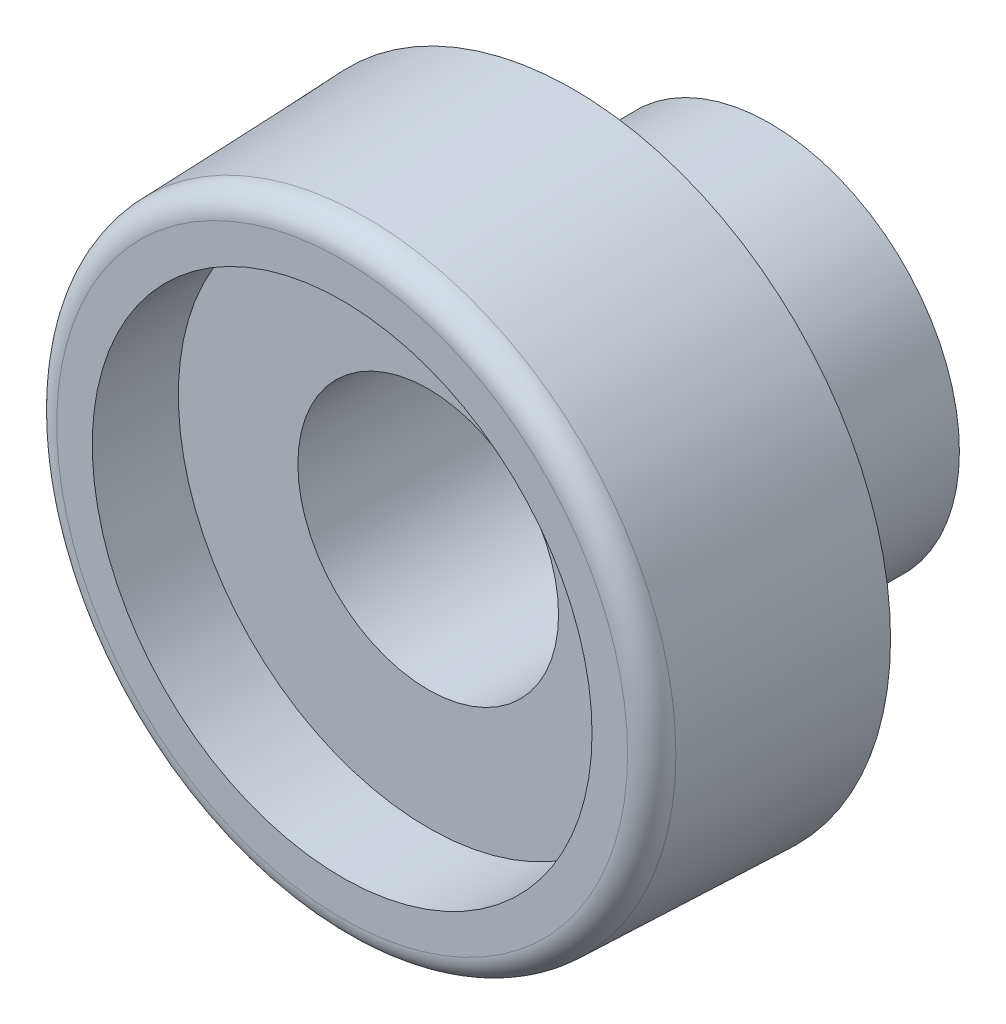
ISO-10303-21;
HEADER;
FILE_DESCRIPTION(('STEP AP214'),'2;1');
FILE_NAME('part.step','',(''),(''),'','','');
FILE_SCHEMA(('AUTOMOTIVE_DESIGN { 1 0 10303 214 1 1 1 1 }'));
ENDSEC;
DATA;
#1=APPLICATION_CONTEXT('core data for automotive mechanical design processes');
#2=APPLICATION_PROTOCOL_DEFINITION('international standard','automotive_design',2000,#1);
#3=PRODUCT_CONTEXT('',#1,'mechanical');
#4=PRODUCT('Part','Part','',(#3));
#5=PRODUCT_RELATED_PRODUCT_CATEGORY('part','',(#4));
#6=PRODUCT_DEFINITION_FORMATION('','',#4);
#7=PRODUCT_DEFINITION_CONTEXT('part definition',#1,'design');
#8=PRODUCT_DEFINITION('design','',#6,#7);
#9=PRODUCT_DEFINITION_SHAPE('','',#8);
#10=(LENGTH_UNIT() NAMED_UNIT(*) SI_UNIT(.MILLI.,.METRE.));
#11=(NAMED_UNIT(*) PLANE_ANGLE_UNIT() SI_UNIT($,.RADIAN.));
#12=(NAMED_UNIT(*) SI_UNIT($,.STERADIAN.) SOLID_ANGLE_UNIT());
#13=UNCERTAINTY_MEASURE_WITH_UNIT(LENGTH_MEASURE(1.E-05),#10,'distance_accuracy_value','');
#14=(GEOMETRIC_REPRESENTATION_CONTEXT(3) GLOBAL_UNCERTAINTY_ASSIGNED_CONTEXT((#13)) GLOBAL_UNIT_ASSIGNED_CONTEXT((#10,
#11,#12)) REPRESENTATION_CONTEXT('',''));
#15=CARTESIAN_POINT('',(0.,0.,0.));
#16=DIRECTION('',(0.,0.,1.));
#17=DIRECTION('',(1.,0.,0.));
#18=AXIS2_PLACEMENT_3D('',#15,#16,#17);
#19=CARTESIAN_POINT('',(0.,0.,0.));
#20=DIRECTION('',(0.,0.,1.));
#21=DIRECTION('',(1.,0.,0.));
#22=AXIS2_PLACEMENT_3D('',#19,#20,#21);
#23=CYLINDRICAL_SURFACE('',#22,2.65);
#24=CARTESIAN_POINT('',(0.,0.,2.95));
#25=DIRECTION('',(0.,0.,1.));
#26=DIRECTION('',(1.,0.,0.));
#27=AXIS2_PLACEMENT_3D('',#24,#25,#26);
#28=CIRCLE('',#27,2.65);
#29=CARTESIAN_POINT('',(2.65,0.,2.95));
#30=VERTEX_POINT('',#29);
#31=EDGE_CURVE('E52',#30,#30,#28,.F.);
#32=ORIENTED_EDGE('',*,*,#31,.F.);
#33=EDGE_LOOP('',(#32));
#34=FACE_BOUND('',#33,.T.);
#35=CARTESIAN_POINT('',(0.,0.,-4.));
#36=DIRECTION('',(0.,0.,-1.));
#37=DIRECTION('',(-1.,0.,0.));
#38=AXIS2_PLACEMENT_3D('',#35,#36,#37);
#39=CIRCLE('',#38,2.65);
#40=CARTESIAN_POINT('',(-2.65,0.,-4.));
#41=VERTEX_POINT('',#40);
#42=EDGE_CURVE('E69',#41,#41,#39,.F.);
#43=ORIENTED_EDGE('',*,*,#42,.F.);
#44=EDGE_LOOP('',(#43));
#45=FACE_BOUND('',#44,.T.);
#46=ADVANCED_FACE('F33',(#34,#45),#23,.F.);
#47=CARTESIAN_POINT('',(0.,0.,4.7));
#48=DIRECTION('',(0.,0.,1.));
#49=DIRECTION('',(1.,0.,0.));
#50=AXIS2_PLACEMENT_3D('',#47,#48,#49);
#51=PLANE('',#50);
#52=CARTESIAN_POINT('',(0.,0.,4.7));
#53=DIRECTION('',(0.,0.,1.));
#54=DIRECTION('',(1.,0.,0.));
#55=AXIS2_PLACEMENT_3D('',#52,#53,#54);
#56=CIRCLE('',#55,5.08074525599957);
#57=CARTESIAN_POINT('',(5.08074525599957,0.,4.7));
#58=VERTEX_POINT('',#57);
#59=EDGE_CURVE('E59',#58,#58,#56,.T.);
#60=ORIENTED_EDGE('',*,*,#59,.F.);
#61=EDGE_LOOP('',(#60));
#62=FACE_BOUND('',#61,.T.);
#63=CARTESIAN_POINT('',(0.,0.,4.7));
#64=DIRECTION('',(0.,0.,1.));
#65=DIRECTION('',(1.,0.,0.));
#66=AXIS2_PLACEMENT_3D('',#63,#64,#65);
#67=CIRCLE('',#66,5.80302799598525);
#68=CARTESIAN_POINT('',(5.80302799598525,0.,4.7));
#69=VERTEX_POINT('',#68);
#70=EDGE_CURVE('E44',#69,#69,#67,.T.);
#71=ORIENTED_EDGE('',*,*,#70,.T.);
#72=EDGE_LOOP('',(#71));
#73=FACE_BOUND('',#72,.T.);
#74=ADVANCED_FACE('F77',(#62,#73),#51,.T.);
#75=CARTESIAN_POINT('',(0.,0.,0.));
#76=DIRECTION('',(0.,0.,1.));
#77=DIRECTION('',(1.,0.,0.));
#78=AXIS2_PLACEMENT_3D('',#75,#76,#77);
#79=PLANE('',#78);
#80=CARTESIAN_POINT('',(0.,0.,0.));
#81=DIRECTION('',(0.,0.,1.));
#82=DIRECTION('',(1.,0.,0.));
#83=AXIS2_PLACEMENT_3D('',#80,#81,#82);
#84=CIRCLE('',#83,3.85);
#85=CARTESIAN_POINT('',(3.85,0.,0.));
#86=VERTEX_POINT('',#85);
#87=EDGE_CURVE('E10',#86,#86,#84,.F.);
#88=ORIENTED_EDGE('',*,*,#87,.F.);
#89=EDGE_LOOP('',(#88));
#90=FACE_BOUND('',#89,.T.);
#91=CARTESIAN_POINT('',(0.,0.,0.));
#92=DIRECTION('',(0.,0.,1.));
#93=DIRECTION('',(1.,0.,0.));
#94=AXIS2_PLACEMENT_3D('',#91,#92,#93);
#95=CIRCLE('',#94,6.45);
#96=CARTESIAN_POINT('',(6.45,0.,0.));
#97=VERTEX_POINT('',#96);
#98=EDGE_CURVE('E49',#97,#97,#95,.T.);
#99=ORIENTED_EDGE('',*,*,#98,.F.);
#100=EDGE_LOOP('',(#99));
#101=FACE_BOUND('',#100,.T.);
#102=ADVANCED_FACE('F83',(#90,#101),#79,.F.);
#103=CARTESIAN_POINT('',(0.,0.,0.));
#104=DIRECTION('',(0.,0.,-1.));
#105=DIRECTION('',(1.,0.,0.));
#106=AXIS2_PLACEMENT_3D('',#103,#104,#105);
#107=CONICAL_SURFACE('',#106,6.45,0.0349065850398866);
#108=CARTESIAN_POINT('',(0.,0.,4.21744974835125));
#109=DIRECTION('',(0.,0.,-1.));
#110=DIRECTION('',(-1.,0.,0.));
#111=AXIS2_PLACEMENT_3D('',#108,#109,#110);
#112=CIRCLE('',#111,6.3027234094948);
#113=CARTESIAN_POINT('',(-6.3027234094948,0.,4.21744974835125));
#114=VERTEX_POINT('',#113);
#115=EDGE_CURVE('E40',#114,#114,#112,.T.);
#116=ORIENTED_EDGE('',*,*,#115,.T.);
#117=EDGE_LOOP('',(#116));
#118=FACE_BOUND('',#117,.T.);
#119=ORIENTED_EDGE('',*,*,#98,.T.);
#120=EDGE_LOOP('',(#119));
#121=FACE_BOUND('',#120,.T.);
#122=ADVANCED_FACE('F91',(#118,#121),#107,.T.);
#123=CARTESIAN_POINT('',(0.,0.,4.2));
#124=DIRECTION('',(0.,0.,1.));
#125=DIRECTION('',(1.,0.,0.));
#126=AXIS2_PLACEMENT_3D('',#123,#124,#125);
#127=TOROIDAL_SURFACE('',#126,5.80302799598525,0.5);
#128=ORIENTED_EDGE('',*,*,#115,.F.);
#129=EDGE_LOOP('',(#128));
#130=FACE_BOUND('',#129,.T.);
#131=ORIENTED_EDGE('',*,*,#70,.F.);
#132=EDGE_LOOP('',(#131));
#133=FACE_BOUND('',#132,.T.);
#134=ADVANCED_FACE('F35',(#130,#133),#127,.T.);
#135=CARTESIAN_POINT('',(0.,0.,2.95));
#136=DIRECTION('',(0.,0.,1.));
#137=DIRECTION('',(1.,0.,0.));
#138=AXIS2_PLACEMENT_3D('',#135,#136,#137);
#139=PLANE('',#138);
#140=CARTESIAN_POINT('',(0.,0.,2.95));
#141=DIRECTION('',(0.,0.,1.));
#142=DIRECTION('',(1.,0.,0.));
#143=AXIS2_PLACEMENT_3D('',#140,#141,#142);
#144=CIRCLE('',#143,5.08074525599957);
#145=CARTESIAN_POINT('',(5.08074525599957,0.,2.95));
#146=VERTEX_POINT('',#145);
#147=EDGE_CURVE('E54',#146,#146,#144,.T.);
#148=ORIENTED_EDGE('',*,*,#147,.T.);
#149=EDGE_LOOP('',(#148));
#150=FACE_BOUND('',#149,.T.);
#151=ORIENTED_EDGE('',*,*,#31,.T.);
#152=EDGE_LOOP('',(#151));
#153=FACE_BOUND('',#152,.T.);
#154=ADVANCED_FACE('F97',(#150,#153),#139,.T.);
#155=CARTESIAN_POINT('',(0.,0.,2.95));
#156=DIRECTION('',(0.,0.,1.));
#157=DIRECTION('',(1.,0.,0.));
#158=AXIS2_PLACEMENT_3D('',#155,#156,#157);
#159=CYLINDRICAL_SURFACE('',#158,5.08074525599957);
#160=ORIENTED_EDGE('',*,*,#147,.F.);
#161=EDGE_LOOP('',(#160));
#162=FACE_BOUND('',#161,.T.);
#163=ORIENTED_EDGE('',*,*,#59,.T.);
#164=EDGE_LOOP('',(#163));
#165=FACE_BOUND('',#164,.T.);
#166=ADVANCED_FACE('F87',(#162,#165),#159,.F.);
#167=CARTESIAN_POINT('',(0.,0.,-4.));
#168=DIRECTION('',(0.,0.,1.));
#169=DIRECTION('',(1.,0.,0.));
#170=AXIS2_PLACEMENT_3D('',#167,#168,#169);
#171=CYLINDRICAL_SURFACE('',#170,3.85);
#172=CARTESIAN_POINT('',(0.,0.,-4.));
#173=DIRECTION('',(0.,0.,-1.));
#174=DIRECTION('',(-1.,0.,0.));
#175=AXIS2_PLACEMENT_3D('',#172,#173,#174);
#176=CIRCLE('',#175,3.85);
#177=CARTESIAN_POINT('',(-3.85,0.,-4.));
#178=VERTEX_POINT('',#177);
#179=EDGE_CURVE('E64',#178,#178,#176,.T.);
#180=ORIENTED_EDGE('',*,*,#179,.F.);
#181=EDGE_LOOP('',(#180));
#182=FACE_BOUND('',#181,.T.);
#183=ORIENTED_EDGE('',*,*,#87,.T.);
#184=EDGE_LOOP('',(#183));
#185=FACE_BOUND('',#184,.T.);
#186=ADVANCED_FACE('F111',(#182,#185),#171,.T.);
#187=CARTESIAN_POINT('',(0.,0.,-4.));
#188=DIRECTION('',(0.,0.,-1.));
#189=DIRECTION('',(-1.,0.,0.));
#190=AXIS2_PLACEMENT_3D('',#187,#188,#189);
#191=PLANE('',#190);
#192=ORIENTED_EDGE('',*,*,#42,.T.);
#193=EDGE_LOOP('',(#192));
#194=FACE_BOUND('',#193,.T.);
#195=ORIENTED_EDGE('',*,*,#179,.T.);
#196=EDGE_LOOP('',(#195));
#197=FACE_BOUND('',#196,.T.);
#198=ADVANCED_FACE('F73',(#194,#197),#191,.T.);
#199=CLOSED_SHELL('',(#46,#74,#102,#122,#134,#154,#166,#186,#198));
#200=MANIFOLD_SOLID_BREP('B2',#199);
#201=ADVANCED_BREP_SHAPE_REPRESENTATION('',(#18,#200),#14);
#202=SHAPE_DEFINITION_REPRESENTATION(#9,#201);
ENDSEC;
END-ISO-10303-21;
